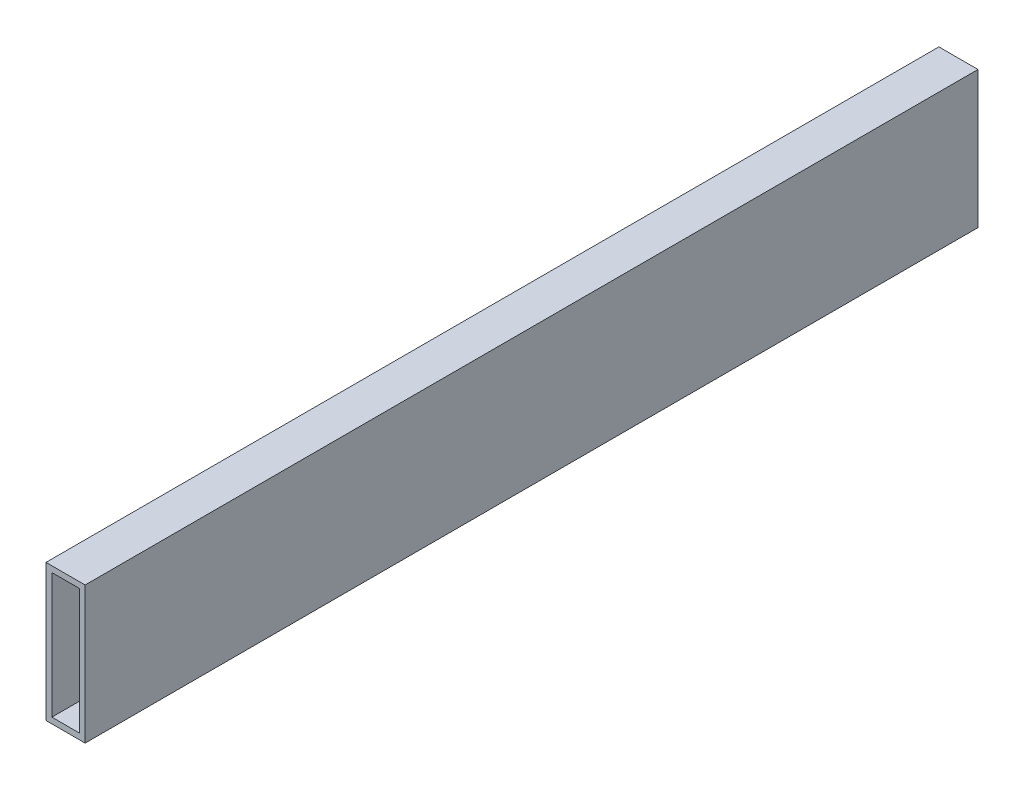
ISO-10303-21;
HEADER;
FILE_DESCRIPTION(('STEP AP214'),'2;1');
FILE_NAME('part.step','',(''),(''),'','','');
FILE_SCHEMA(('AUTOMOTIVE_DESIGN { 1 0 10303 214 1 1 1 1 }'));
ENDSEC;
DATA;
#1=APPLICATION_CONTEXT('core data for automotive mechanical design processes');
#2=APPLICATION_PROTOCOL_DEFINITION('international standard','automotive_design',2000,#1);
#3=PRODUCT_CONTEXT('',#1,'mechanical');
#4=PRODUCT('Part','Part','',(#3));
#5=PRODUCT_RELATED_PRODUCT_CATEGORY('part','',(#4));
#6=PRODUCT_DEFINITION_FORMATION('','',#4);
#7=PRODUCT_DEFINITION_CONTEXT('part definition',#1,'design');
#8=PRODUCT_DEFINITION('design','',#6,#7);
#9=PRODUCT_DEFINITION_SHAPE('','',#8);
#10=(LENGTH_UNIT() NAMED_UNIT(*) SI_UNIT(.MILLI.,.METRE.));
#11=(NAMED_UNIT(*) PLANE_ANGLE_UNIT() SI_UNIT($,.RADIAN.));
#12=(NAMED_UNIT(*) SI_UNIT($,.STERADIAN.) SOLID_ANGLE_UNIT());
#13=UNCERTAINTY_MEASURE_WITH_UNIT(LENGTH_MEASURE(1.E-05),#10,'distance_accuracy_value','');
#14=(GEOMETRIC_REPRESENTATION_CONTEXT(3) GLOBAL_UNCERTAINTY_ASSIGNED_CONTEXT((#13)) GLOBAL_UNIT_ASSIGNED_CONTEXT((#10,
#11,#12)) REPRESENTATION_CONTEXT('',''));
#15=CARTESIAN_POINT('',(0.,0.,0.));
#16=DIRECTION('',(0.,0.,1.));
#17=DIRECTION('',(1.,0.,0.));
#18=AXIS2_PLACEMENT_3D('',#15,#16,#17);
#19=CARTESIAN_POINT('',(20.,0.,-122.801098892805));
#20=DIRECTION('',(1.,0.,0.));
#21=DIRECTION('',(0.,0.,-1.));
#22=AXIS2_PLACEMENT_3D('',#19,#20,#21);
#23=PLANE('',#22);
#24=DIRECTION('',(0.,0.,1.));
#25=VECTOR('',#24,1.);
#26=CARTESIAN_POINT('',(20.,0.,-122.801098892805));
#27=LINE('',#26,#25);
#28=CARTESIAN_POINT('',(20.,0.,-50.));
#29=VERTEX_POINT('',#28);
#30=CARTESIAN_POINT('',(20.,0.,406.293714059227));
#31=VERTEX_POINT('',#30);
#32=EDGE_CURVE('E147',#29,#31,#27,.T.);
#33=ORIENTED_EDGE('',*,*,#32,.F.);
#34=DIRECTION('',(0.,1.,0.));
#35=VECTOR('',#34,1.);
#36=CARTESIAN_POINT('',(20.,0.,-49.9999999999999));
#37=LINE('',#36,#35);
#38=CARTESIAN_POINT('',(20.,70.,-49.9999999999999));
#39=VERTEX_POINT('',#38);
#40=EDGE_CURVE('E105',#29,#39,#37,.T.);
#41=ORIENTED_EDGE('',*,*,#40,.T.);
#42=DIRECTION('',(0.,0.,1.));
#43=VECTOR('',#42,1.);
#44=CARTESIAN_POINT('',(20.,70.,-122.801098892805));
#45=LINE('',#44,#43);
#46=CARTESIAN_POINT('',(20.,70.,406.293714059227));
#47=VERTEX_POINT('',#46);
#48=EDGE_CURVE('E51',#39,#47,#45,.T.);
#49=ORIENTED_EDGE('',*,*,#48,.T.);
#50=DIRECTION('',(0.,-1.,0.));
#51=VECTOR('',#50,1.);
#52=CARTESIAN_POINT('',(20.,-2.54183678231502E-13,406.293714059227));
#53=LINE('',#52,#51);
#54=EDGE_CURVE('E103',#47,#31,#53,.T.);
#55=ORIENTED_EDGE('',*,*,#54,.T.);
#56=EDGE_LOOP('',(#33,#41,#49,#55));
#57=FACE_BOUND('',#56,.T.);
#58=ADVANCED_FACE('F34',(#57),#23,.T.);
#59=CARTESIAN_POINT('',(0.,0.,-122.801098892805));
#60=DIRECTION('',(0.,-1.,0.));
#61=DIRECTION('',(0.,0.,-1.));
#62=AXIS2_PLACEMENT_3D('',#59,#60,#61);
#63=PLANE('',#62);
#64=DIRECTION('',(0.,0.,1.));
#65=VECTOR('',#64,1.);
#66=CARTESIAN_POINT('',(0.,0.,-122.801098892805));
#67=LINE('',#66,#65);
#68=CARTESIAN_POINT('',(0.,0.,-50.));
#69=VERTEX_POINT('',#68);
#70=CARTESIAN_POINT('',(0.,0.,406.293714059227));
#71=VERTEX_POINT('',#70);
#72=EDGE_CURVE('E153',#69,#71,#67,.T.);
#73=ORIENTED_EDGE('',*,*,#72,.F.);
#74=DIRECTION('',(1.,0.,0.));
#75=VECTOR('',#74,1.);
#76=CARTESIAN_POINT('',(-2.54183678231503E-13,0.,-50.));
#77=LINE('',#76,#75);
#78=EDGE_CURVE('E107',#69,#29,#77,.T.);
#79=ORIENTED_EDGE('',*,*,#78,.T.);
#80=ORIENTED_EDGE('',*,*,#32,.T.);
#81=DIRECTION('',(-1.,0.,0.));
#82=VECTOR('',#81,1.);
#83=CARTESIAN_POINT('',(2.54183678231502E-13,0.,406.293714059227));
#84=LINE('',#83,#82);
#85=EDGE_CURVE('E117',#31,#71,#84,.T.);
#86=ORIENTED_EDGE('',*,*,#85,.T.);
#87=EDGE_LOOP('',(#73,#79,#80,#86));
#88=FACE_BOUND('',#87,.T.);
#89=ADVANCED_FACE('F178',(#88),#63,.T.);
#90=CARTESIAN_POINT('',(0.,0.,-122.801098892805));
#91=DIRECTION('',(1.,0.,0.));
#92=DIRECTION('',(0.,0.,-1.));
#93=AXIS2_PLACEMENT_3D('',#90,#91,#92);
#94=PLANE('',#93);
#95=DIRECTION('',(0.,1.,0.));
#96=VECTOR('',#95,1.);
#97=CARTESIAN_POINT('',(0.,0.,-50.));
#98=LINE('',#97,#96);
#99=CARTESIAN_POINT('',(0.,70.,-50.));
#100=VERTEX_POINT('',#99);
#101=EDGE_CURVE('E142',#69,#100,#98,.T.);
#102=ORIENTED_EDGE('',*,*,#101,.F.);
#103=ORIENTED_EDGE('',*,*,#72,.T.);
#104=DIRECTION('',(0.,1.,0.));
#105=VECTOR('',#104,1.);
#106=CARTESIAN_POINT('',(0.,69.9999999999998,406.293714059227));
#107=LINE('',#106,#105);
#108=CARTESIAN_POINT('',(0.,70.,406.293714059227));
#109=VERTEX_POINT('',#108);
#110=EDGE_CURVE('E121',#71,#109,#107,.T.);
#111=ORIENTED_EDGE('',*,*,#110,.T.);
#112=DIRECTION('',(0.,0.,1.));
#113=VECTOR('',#112,1.);
#114=CARTESIAN_POINT('',(0.,70.,-122.801098892805));
#115=LINE('',#114,#113);
#116=EDGE_CURVE('E120',#100,#109,#115,.T.);
#117=ORIENTED_EDGE('',*,*,#116,.F.);
#118=EDGE_LOOP('',(#102,#103,#111,#117));
#119=FACE_BOUND('',#118,.T.);
#120=ADVANCED_FACE('F182',(#119),#94,.F.);
#121=CARTESIAN_POINT('',(0.,67.,-122.801098892805));
#122=DIRECTION('',(0.,1.,0.));
#123=DIRECTION('',(0.,0.,1.));
#124=AXIS2_PLACEMENT_3D('',#121,#122,#123);
#125=PLANE('',#124);
#126=DIRECTION('',(-1.,0.,0.));
#127=VECTOR('',#126,1.);
#128=CARTESIAN_POINT('',(-2.54183678231503E-13,67.,-50.));
#129=LINE('',#128,#127);
#130=CARTESIAN_POINT('',(17.,67.,-50.));
#131=VERTEX_POINT('',#130);
#132=CARTESIAN_POINT('',(3.,67.,-50.));
#133=VERTEX_POINT('',#132);
#134=EDGE_CURVE('E138',#131,#133,#129,.T.);
#135=ORIENTED_EDGE('',*,*,#134,.F.);
#136=DIRECTION('',(0.,0.,1.));
#137=VECTOR('',#136,1.);
#138=CARTESIAN_POINT('',(17.,67.,-122.801098892805));
#139=LINE('',#138,#137);
#140=CARTESIAN_POINT('',(17.,67.,406.293714059227));
#141=VERTEX_POINT('',#140);
#142=EDGE_CURVE('E38',#131,#141,#139,.T.);
#143=ORIENTED_EDGE('',*,*,#142,.T.);
#144=DIRECTION('',(1.,0.,0.));
#145=VECTOR('',#144,1.);
#146=CARTESIAN_POINT('',(17.0000000000003,67.,406.293714059227));
#147=LINE('',#146,#145);
#148=CARTESIAN_POINT('',(3.,67.,406.293714059227));
#149=VERTEX_POINT('',#148);
#150=EDGE_CURVE('E129',#149,#141,#147,.T.);
#151=ORIENTED_EDGE('',*,*,#150,.F.);
#152=DIRECTION('',(0.,0.,1.));
#153=VECTOR('',#152,1.);
#154=CARTESIAN_POINT('',(3.,67.,-122.801098892805));
#155=LINE('',#154,#153);
#156=EDGE_CURVE('E157',#133,#149,#155,.T.);
#157=ORIENTED_EDGE('',*,*,#156,.F.);
#158=EDGE_LOOP('',(#135,#143,#151,#157));
#159=FACE_BOUND('',#158,.T.);
#160=ADVANCED_FACE('F174',(#159),#125,.F.);
#161=CARTESIAN_POINT('',(3.,0.,-122.801098892805));
#162=DIRECTION('',(-1.,0.,0.));
#163=DIRECTION('',(0.,0.,1.));
#164=AXIS2_PLACEMENT_3D('',#161,#162,#163);
#165=PLANE('',#164);
#166=DIRECTION('',(0.,-1.,0.));
#167=VECTOR('',#166,1.);
#168=CARTESIAN_POINT('',(3.,0.,-50.));
#169=LINE('',#168,#167);
#170=CARTESIAN_POINT('',(3.,3.,-50.));
#171=VERTEX_POINT('',#170);
#172=EDGE_CURVE('E43',#133,#171,#169,.T.);
#173=ORIENTED_EDGE('',*,*,#172,.F.);
#174=ORIENTED_EDGE('',*,*,#156,.T.);
#175=DIRECTION('',(0.,1.,0.));
#176=VECTOR('',#175,1.);
#177=CARTESIAN_POINT('',(3.,66.9999999999998,406.293714059227));
#178=LINE('',#177,#176);
#179=CARTESIAN_POINT('',(3.,3.,406.293714059227));
#180=VERTEX_POINT('',#179);
#181=EDGE_CURVE('E123',#180,#149,#178,.T.);
#182=ORIENTED_EDGE('',*,*,#181,.F.);
#183=DIRECTION('',(0.,0.,1.));
#184=VECTOR('',#183,1.);
#185=CARTESIAN_POINT('',(3.,3.,-122.801098892805));
#186=LINE('',#185,#184);
#187=EDGE_CURVE('E159',#171,#180,#186,.T.);
#188=ORIENTED_EDGE('',*,*,#187,.F.);
#189=EDGE_LOOP('',(#173,#174,#182,#188));
#190=FACE_BOUND('',#189,.T.);
#191=ADVANCED_FACE('F170',(#190),#165,.F.);
#192=CARTESIAN_POINT('',(0.,3.,-122.801098892805));
#193=DIRECTION('',(0.,-1.,0.));
#194=DIRECTION('',(0.,0.,-1.));
#195=AXIS2_PLACEMENT_3D('',#192,#193,#194);
#196=PLANE('',#195);
#197=DIRECTION('',(1.,0.,0.));
#198=VECTOR('',#197,1.);
#199=CARTESIAN_POINT('',(-2.54183678231503E-13,3.,-50.));
#200=LINE('',#199,#198);
#201=CARTESIAN_POINT('',(17.,3.,-50.));
#202=VERTEX_POINT('',#201);
#203=EDGE_CURVE('E11',#171,#202,#200,.T.);
#204=ORIENTED_EDGE('',*,*,#203,.F.);
#205=ORIENTED_EDGE('',*,*,#187,.T.);
#206=DIRECTION('',(-1.,0.,0.));
#207=VECTOR('',#206,1.);
#208=CARTESIAN_POINT('',(3.00000000000025,3.,406.293714059227));
#209=LINE('',#208,#207);
#210=CARTESIAN_POINT('',(17.,3.,406.293714059227));
#211=VERTEX_POINT('',#210);
#212=EDGE_CURVE('E130',#211,#180,#209,.T.);
#213=ORIENTED_EDGE('',*,*,#212,.F.);
#214=DIRECTION('',(0.,0.,1.));
#215=VECTOR('',#214,1.);
#216=CARTESIAN_POINT('',(17.,3.,-122.801098892805));
#217=LINE('',#216,#215);
#218=EDGE_CURVE('E155',#202,#211,#217,.T.);
#219=ORIENTED_EDGE('',*,*,#218,.F.);
#220=EDGE_LOOP('',(#204,#205,#213,#219));
#221=FACE_BOUND('',#220,.T.);
#222=ADVANCED_FACE('F167',(#221),#196,.F.);
#223=CARTESIAN_POINT('',(17.,0.,-122.801098892805));
#224=DIRECTION('',(1.,0.,0.));
#225=DIRECTION('',(0.,0.,-1.));
#226=AXIS2_PLACEMENT_3D('',#223,#224,#225);
#227=PLANE('',#226);
#228=DIRECTION('',(0.,1.,0.));
#229=VECTOR('',#228,1.);
#230=CARTESIAN_POINT('',(17.,0.,-50.));
#231=LINE('',#230,#229);
#232=EDGE_CURVE('E141',#202,#131,#231,.T.);
#233=ORIENTED_EDGE('',*,*,#232,.F.);
#234=ORIENTED_EDGE('',*,*,#218,.T.);
#235=DIRECTION('',(0.,-1.,0.));
#236=VECTOR('',#235,1.);
#237=CARTESIAN_POINT('',(17.,2.99999999999975,406.293714059227));
#238=LINE('',#237,#236);
#239=EDGE_CURVE('E133',#141,#211,#238,.T.);
#240=ORIENTED_EDGE('',*,*,#239,.F.);
#241=ORIENTED_EDGE('',*,*,#142,.F.);
#242=EDGE_LOOP('',(#233,#234,#240,#241));
#243=FACE_BOUND('',#242,.T.);
#244=ADVANCED_FACE('F160',(#243),#227,.F.);
#245=CARTESIAN_POINT('',(0.,70.,-122.801098892805));
#246=DIRECTION('',(0.,-1.,0.));
#247=DIRECTION('',(0.,0.,-1.));
#248=AXIS2_PLACEMENT_3D('',#245,#246,#247);
#249=PLANE('',#248);
#250=DIRECTION('',(1.,0.,0.));
#251=VECTOR('',#250,1.);
#252=CARTESIAN_POINT('',(-2.54183678231503E-13,70.,-50.));
#253=LINE('',#252,#251);
#254=EDGE_CURVE('E145',#100,#39,#253,.T.);
#255=ORIENTED_EDGE('',*,*,#254,.F.);
#256=ORIENTED_EDGE('',*,*,#116,.T.);
#257=DIRECTION('',(1.,0.,0.));
#258=VECTOR('',#257,1.);
#259=CARTESIAN_POINT('',(20.0000000000003,70.,406.293714059227));
#260=LINE('',#259,#258);
#261=EDGE_CURVE('E114',#109,#47,#260,.T.);
#262=ORIENTED_EDGE('',*,*,#261,.T.);
#263=ORIENTED_EDGE('',*,*,#48,.F.);
#264=EDGE_LOOP('',(#255,#256,#262,#263));
#265=FACE_BOUND('',#264,.T.);
#266=ADVANCED_FACE('F119',(#265),#249,.F.);
#267=CARTESIAN_POINT('',(19.9999999999991,80.4054988232821,-49.9999999999999));
#268=DIRECTION('',(0.,0.,-1.));
#269=DIRECTION('',(-1.,0.,0.));
#270=AXIS2_PLACEMENT_3D('',#267,#268,#269);
#271=PLANE('',#270);
#272=ORIENTED_EDGE('',*,*,#40,.F.);
#273=ORIENTED_EDGE('',*,*,#78,.F.);
#274=ORIENTED_EDGE('',*,*,#101,.T.);
#275=ORIENTED_EDGE('',*,*,#254,.T.);
#276=EDGE_LOOP('',(#272,#273,#274,#275));
#277=FACE_BOUND('',#276,.T.);
#278=ORIENTED_EDGE('',*,*,#232,.T.);
#279=ORIENTED_EDGE('',*,*,#134,.T.);
#280=ORIENTED_EDGE('',*,*,#172,.T.);
#281=ORIENTED_EDGE('',*,*,#203,.T.);
#282=EDGE_LOOP('',(#278,#279,#280,#281));
#283=FACE_BOUND('',#282,.T.);
#284=ADVANCED_FACE('F36',(#277,#283),#271,.T.);
#285=CARTESIAN_POINT('',(19.999999999998,80.4054988232821,406.293714059227));
#286=DIRECTION('',(0.,0.,-1.));
#287=DIRECTION('',(-1.,0.,0.));
#288=AXIS2_PLACEMENT_3D('',#285,#286,#287);
#289=PLANE('',#288);
#290=ORIENTED_EDGE('',*,*,#181,.T.);
#291=ORIENTED_EDGE('',*,*,#150,.T.);
#292=ORIENTED_EDGE('',*,*,#239,.T.);
#293=ORIENTED_EDGE('',*,*,#212,.T.);
#294=EDGE_LOOP('',(#290,#291,#292,#293));
#295=FACE_BOUND('',#294,.T.);
#296=ORIENTED_EDGE('',*,*,#54,.F.);
#297=ORIENTED_EDGE('',*,*,#261,.F.);
#298=ORIENTED_EDGE('',*,*,#110,.F.);
#299=ORIENTED_EDGE('',*,*,#85,.F.);
#300=EDGE_LOOP('',(#296,#297,#298,#299));
#301=FACE_BOUND('',#300,.T.);
#302=ADVANCED_FACE('F112',(#295,#301),#289,.F.);
#303=CLOSED_SHELL('',(#58,#89,#120,#160,#191,#222,#244,#266,#284,#302));
#304=MANIFOLD_SOLID_BREP('B2',#303);
#305=ADVANCED_BREP_SHAPE_REPRESENTATION('',(#18,#304),#14);
#306=SHAPE_DEFINITION_REPRESENTATION(#9,#305);
ENDSEC;
END-ISO-10303-21;
